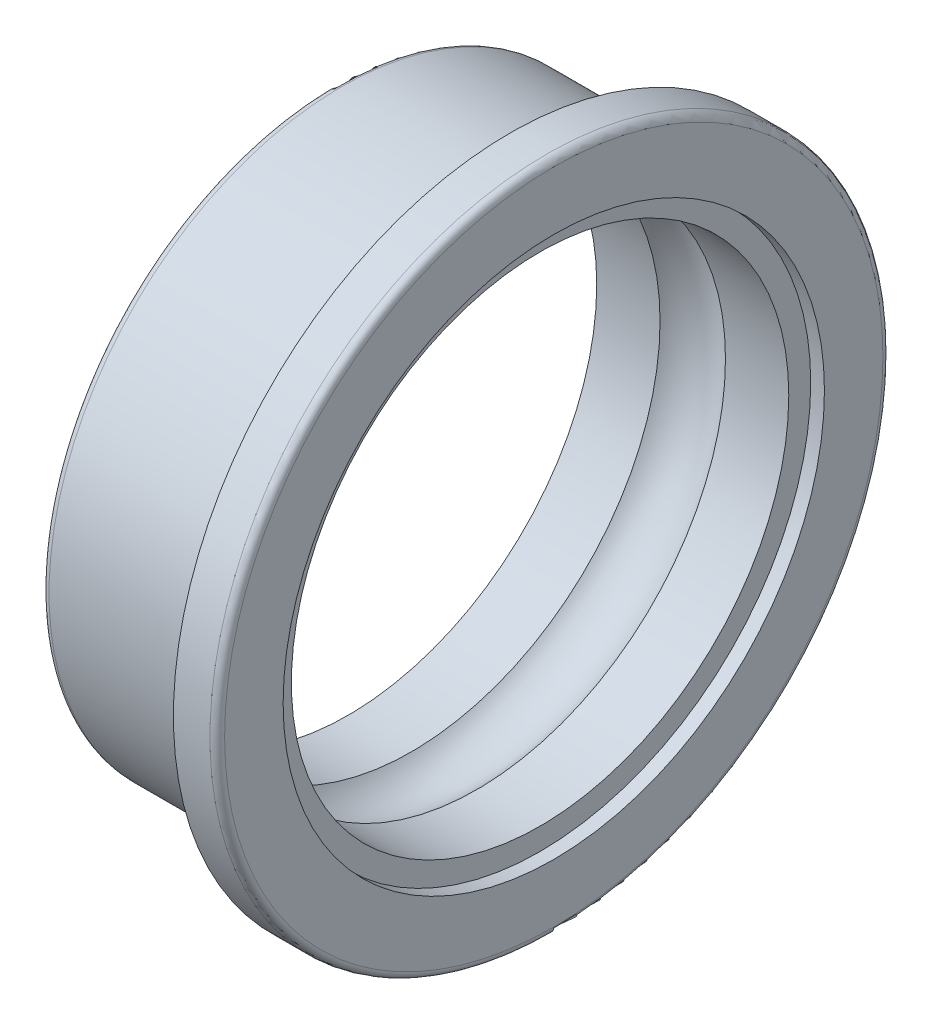
ISO-10303-21;
HEADER;
FILE_DESCRIPTION(('STEP AP214'),'2;1');
FILE_NAME('part.step','',(''),(''),'','','');
FILE_SCHEMA(('AUTOMOTIVE_DESIGN { 1 0 10303 214 1 1 1 1 }'));
ENDSEC;
DATA;
#1=APPLICATION_CONTEXT('core data for automotive mechanical design processes');
#2=APPLICATION_PROTOCOL_DEFINITION('international standard','automotive_design',2000,#1);
#3=PRODUCT_CONTEXT('',#1,'mechanical');
#4=PRODUCT('Part','Part','',(#3));
#5=PRODUCT_RELATED_PRODUCT_CATEGORY('part','',(#4));
#6=PRODUCT_DEFINITION_FORMATION('','',#4);
#7=PRODUCT_DEFINITION_CONTEXT('part definition',#1,'design');
#8=PRODUCT_DEFINITION('design','',#6,#7);
#9=PRODUCT_DEFINITION_SHAPE('','',#8);
#10=(LENGTH_UNIT() NAMED_UNIT(*) SI_UNIT(.MILLI.,.METRE.));
#11=(NAMED_UNIT(*) PLANE_ANGLE_UNIT() SI_UNIT($,.RADIAN.));
#12=(NAMED_UNIT(*) SI_UNIT($,.STERADIAN.) SOLID_ANGLE_UNIT());
#13=UNCERTAINTY_MEASURE_WITH_UNIT(LENGTH_MEASURE(1.E-05),#10,'distance_accuracy_value','');
#14=(GEOMETRIC_REPRESENTATION_CONTEXT(3) GLOBAL_UNCERTAINTY_ASSIGNED_CONTEXT((#13)) GLOBAL_UNIT_ASSIGNED_CONTEXT((#10,
#11,#12)) REPRESENTATION_CONTEXT('',''));
#15=CARTESIAN_POINT('',(0.,0.,0.));
#16=DIRECTION('',(0.,0.,1.));
#17=DIRECTION('',(1.,0.,0.));
#18=AXIS2_PLACEMENT_3D('',#15,#16,#17);
#19=CARTESIAN_POINT('',(0.,3.9,0.));
#20=DIRECTION('',(-1.,0.,0.));
#21=DIRECTION('',(0.,0.,1.));
#22=AXIS2_PLACEMENT_3D('',#19,#20,#21);
#23=PLANE('',#22);
#24=CARTESIAN_POINT('',(0.,0.,0.));
#25=DIRECTION('',(1.,0.,0.));
#26=DIRECTION('',(0.,0.,-1.));
#27=AXIS2_PLACEMENT_3D('',#24,#25,#26);
#28=CIRCLE('',#27,3.7);
#29=CARTESIAN_POINT('',(0.,0.,-3.7));
#30=VERTEX_POINT('',#29);
#31=EDGE_CURVE('E5',#30,#30,#28,.T.);
#32=ORIENTED_EDGE('',*,*,#31,.T.);
#33=EDGE_LOOP('',(#32));
#34=FACE_BOUND('',#33,.T.);
#35=CARTESIAN_POINT('',(0.,0.,0.));
#36=DIRECTION('',(1.,0.,0.));
#37=DIRECTION('',(0.,0.,-1.));
#38=AXIS2_PLACEMENT_3D('',#35,#36,#37);
#39=CIRCLE('',#38,3.89999999635005);
#40=CARTESIAN_POINT('',(0.,0.,-3.89999999635005));
#41=VERTEX_POINT('',#40);
#42=EDGE_CURVE('E9',#41,#41,#39,.T.);
#43=ORIENTED_EDGE('',*,*,#42,.F.);
#44=EDGE_LOOP('',(#43));
#45=FACE_BOUND('',#44,.T.);
#46=ADVANCED_FACE('F13',(#34,#45),#23,.T.);
#47=CARTESIAN_POINT('',(3.,0.,0.));
#48=DIRECTION('',(1.,0.,0.));
#49=DIRECTION('',(0.,0.,-1.));
#50=AXIS2_PLACEMENT_3D('',#47,#48,#49);
#51=CYLINDRICAL_SURFACE('',#50,3.7);
#52=CARTESIAN_POINT('',(0.1875,0.,0.));
#53=DIRECTION('',(1.,0.,0.));
#54=DIRECTION('',(0.,0.,-1.));
#55=AXIS2_PLACEMENT_3D('',#52,#53,#54);
#56=CIRCLE('',#55,3.7);
#57=CARTESIAN_POINT('',(0.1875,0.,-3.7));
#58=VERTEX_POINT('',#57);
#59=EDGE_CURVE('E24',#58,#58,#56,.T.);
#60=ORIENTED_EDGE('',*,*,#59,.T.);
#61=EDGE_LOOP('',(#60));
#62=FACE_BOUND('',#61,.T.);
#63=ORIENTED_EDGE('',*,*,#31,.F.);
#64=EDGE_LOOP('',(#63));
#65=FACE_BOUND('',#64,.T.);
#66=ADVANCED_FACE('F30',(#62,#65),#51,.F.);
#67=CARTESIAN_POINT('',(0.099999999999923,0.,0.));
#68=DIRECTION('',(1.,0.,0.));
#69=DIRECTION('',(0.,0.,-1.));
#70=AXIS2_PLACEMENT_3D('',#67,#68,#69);
#71=TOROIDAL_SURFACE('',#70,3.90000000000007,0.0999999999999235);
#72=ORIENTED_EDGE('',*,*,#42,.T.);
#73=EDGE_LOOP('',(#72));
#74=FACE_BOUND('',#73,.T.);
#75=CARTESIAN_POINT('',(0.1,0.,0.));
#76=DIRECTION('',(1.,0.,0.));
#77=DIRECTION('',(0.,0.,-1.));
#78=AXIS2_PLACEMENT_3D('',#75,#76,#77);
#79=CIRCLE('',#78,4.);
#80=CARTESIAN_POINT('',(0.1,0.,-4.));
#81=VERTEX_POINT('',#80);
#82=EDGE_CURVE('E39',#81,#81,#79,.T.);
#83=ORIENTED_EDGE('',*,*,#82,.F.);
#84=EDGE_LOOP('',(#83));
#85=FACE_BOUND('',#84,.T.);
#86=ADVANCED_FACE('F43',(#74,#85),#71,.T.);
#87=CARTESIAN_POINT('',(0.1875,3.7,0.));
#88=DIRECTION('',(-1.,0.,0.));
#89=DIRECTION('',(0.,0.,1.));
#90=AXIS2_PLACEMENT_3D('',#87,#88,#89);
#91=PLANE('',#90);
#92=CARTESIAN_POINT('',(0.1875,0.,0.));
#93=DIRECTION('',(1.,0.,0.));
#94=DIRECTION('',(0.,0.,-1.));
#95=AXIS2_PLACEMENT_3D('',#92,#93,#94);
#96=CIRCLE('',#95,3.4);
#97=CARTESIAN_POINT('',(0.1875,0.,-3.4));
#98=VERTEX_POINT('',#97);
#99=EDGE_CURVE('E50',#98,#98,#96,.T.);
#100=ORIENTED_EDGE('',*,*,#99,.T.);
#101=EDGE_LOOP('',(#100));
#102=FACE_BOUND('',#101,.T.);
#103=ORIENTED_EDGE('',*,*,#59,.F.);
#104=EDGE_LOOP('',(#103));
#105=FACE_BOUND('',#104,.T.);
#106=ADVANCED_FACE('F56',(#102,#105),#91,.T.);
#107=CARTESIAN_POINT('',(3.,0.,0.));
#108=DIRECTION('',(1.,0.,0.));
#109=DIRECTION('',(0.,0.,-1.));
#110=AXIS2_PLACEMENT_3D('',#107,#108,#109);
#111=CYLINDRICAL_SURFACE('',#110,4.);
#112=ORIENTED_EDGE('',*,*,#82,.T.);
#113=EDGE_LOOP('',(#112));
#114=FACE_BOUND('',#113,.T.);
#115=CARTESIAN_POINT('',(2.4,0.,0.));
#116=DIRECTION('',(1.,0.,0.));
#117=DIRECTION('',(0.,0.,-1.));
#118=AXIS2_PLACEMENT_3D('',#115,#116,#117);
#119=CIRCLE('',#118,4.);
#120=CARTESIAN_POINT('',(2.4,0.,-4.));
#121=VERTEX_POINT('',#120);
#122=EDGE_CURVE('E65',#121,#121,#119,.T.);
#123=ORIENTED_EDGE('',*,*,#122,.F.);
#124=EDGE_LOOP('',(#123));
#125=FACE_BOUND('',#124,.T.);
#126=ADVANCED_FACE('F69',(#114,#125),#111,.T.);
#127=CARTESIAN_POINT('',(3.,0.,0.));
#128=DIRECTION('',(1.,0.,0.));
#129=DIRECTION('',(0.,0.,-1.));
#130=AXIS2_PLACEMENT_3D('',#127,#128,#129);
#131=CYLINDRICAL_SURFACE('',#130,3.4);
#132=CARTESIAN_POINT('',(1.0527864045,0.,0.));
#133=DIRECTION('',(1.,0.,0.));
#134=DIRECTION('',(0.,0.,-1.));
#135=AXIS2_PLACEMENT_3D('',#132,#133,#134);
#136=CIRCLE('',#135,3.4);
#137=CARTESIAN_POINT('',(1.0527864045,0.,-3.4));
#138=VERTEX_POINT('',#137);
#139=EDGE_CURVE('E76',#138,#138,#136,.T.);
#140=ORIENTED_EDGE('',*,*,#139,.T.);
#141=EDGE_LOOP('',(#140));
#142=FACE_BOUND('',#141,.T.);
#143=ORIENTED_EDGE('',*,*,#99,.F.);
#144=EDGE_LOOP('',(#143));
#145=FACE_BOUND('',#144,.T.);
#146=ADVANCED_FACE('F82',(#142,#145),#131,.F.);
#147=CARTESIAN_POINT('',(2.4,4.6,0.));
#148=DIRECTION('',(-1.,0.,0.));
#149=DIRECTION('',(0.,0.,1.));
#150=AXIS2_PLACEMENT_3D('',#147,#148,#149);
#151=PLANE('',#150);
#152=ORIENTED_EDGE('',*,*,#122,.T.);
#153=EDGE_LOOP('',(#152));
#154=FACE_BOUND('',#153,.T.);
#155=CARTESIAN_POINT('',(2.4,0.,0.));
#156=DIRECTION('',(1.,0.,0.));
#157=DIRECTION('',(0.,0.,-1.));
#158=AXIS2_PLACEMENT_3D('',#155,#156,#157);
#159=CIRCLE('',#158,4.6);
#160=CARTESIAN_POINT('',(2.4,0.,-4.6));
#161=VERTEX_POINT('',#160);
#162=EDGE_CURVE('E91',#161,#161,#159,.T.);
#163=ORIENTED_EDGE('',*,*,#162,.F.);
#164=EDGE_LOOP('',(#163));
#165=FACE_BOUND('',#164,.T.);
#166=ADVANCED_FACE('F95',(#154,#165),#151,.T.);
#167=CARTESIAN_POINT('',(1.5,0.,0.));
#168=DIRECTION('',(1.,0.,0.));
#169=DIRECTION('',(0.,0.,-1.));
#170=AXIS2_PLACEMENT_3D('',#167,#168,#169);
#171=TOROIDAL_SURFACE('',#170,2.99999999999991,0.600000000000093);
#172=ORIENTED_EDGE('',*,*,#139,.F.);
#173=EDGE_LOOP('',(#172));
#174=FACE_BOUND('',#173,.T.);
#175=CARTESIAN_POINT('',(1.9472135955,0.,0.));
#176=DIRECTION('',(1.,0.,0.));
#177=DIRECTION('',(0.,0.,-1.));
#178=AXIS2_PLACEMENT_3D('',#175,#176,#177);
#179=CIRCLE('',#178,3.4);
#180=CARTESIAN_POINT('',(1.9472135955,0.,-3.4));
#181=VERTEX_POINT('',#180);
#182=EDGE_CURVE('E104',#181,#181,#179,.T.);
#183=ORIENTED_EDGE('',*,*,#182,.T.);
#184=EDGE_LOOP('',(#183));
#185=FACE_BOUND('',#184,.T.);
#186=ADVANCED_FACE('F108',(#174,#185),#171,.F.);
#187=CARTESIAN_POINT('',(3.,0.,0.));
#188=DIRECTION('',(1.,0.,0.));
#189=DIRECTION('',(0.,0.,-1.));
#190=AXIS2_PLACEMENT_3D('',#187,#188,#189);
#191=CYLINDRICAL_SURFACE('',#190,4.6);
#192=ORIENTED_EDGE('',*,*,#162,.T.);
#193=EDGE_LOOP('',(#192));
#194=FACE_BOUND('',#193,.T.);
#195=CARTESIAN_POINT('',(2.9,0.,0.));
#196=DIRECTION('',(1.,0.,0.));
#197=DIRECTION('',(0.,0.,-1.));
#198=AXIS2_PLACEMENT_3D('',#195,#196,#197);
#199=CIRCLE('',#198,4.6);
#200=CARTESIAN_POINT('',(2.9,0.,-4.6));
#201=VERTEX_POINT('',#200);
#202=EDGE_CURVE('E117',#201,#201,#199,.T.);
#203=ORIENTED_EDGE('',*,*,#202,.F.);
#204=EDGE_LOOP('',(#203));
#205=FACE_BOUND('',#204,.T.);
#206=ADVANCED_FACE('F121',(#194,#205),#191,.T.);
#207=CARTESIAN_POINT('',(3.,0.,0.));
#208=DIRECTION('',(1.,0.,0.));
#209=DIRECTION('',(0.,0.,-1.));
#210=AXIS2_PLACEMENT_3D('',#207,#208,#209);
#211=CYLINDRICAL_SURFACE('',#210,3.4);
#212=CARTESIAN_POINT('',(2.8125,0.,0.));
#213=DIRECTION('',(1.,0.,0.));
#214=DIRECTION('',(0.,0.,-1.));
#215=AXIS2_PLACEMENT_3D('',#212,#213,#214);
#216=CIRCLE('',#215,3.4);
#217=CARTESIAN_POINT('',(2.8125,0.,-3.4));
#218=VERTEX_POINT('',#217);
#219=EDGE_CURVE('E128',#218,#218,#216,.T.);
#220=ORIENTED_EDGE('',*,*,#219,.T.);
#221=EDGE_LOOP('',(#220));
#222=FACE_BOUND('',#221,.T.);
#223=ORIENTED_EDGE('',*,*,#182,.F.);
#224=EDGE_LOOP('',(#223));
#225=FACE_BOUND('',#224,.T.);
#226=ADVANCED_FACE('F134',(#222,#225),#211,.F.);
#227=CARTESIAN_POINT('',(2.90000000000015,0.,0.));
#228=DIRECTION('',(1.,0.,0.));
#229=DIRECTION('',(0.,0.,-1.));
#230=AXIS2_PLACEMENT_3D('',#227,#228,#229);
#231=TOROIDAL_SURFACE('',#230,4.50000000000015,0.0999999999998467);
#232=ORIENTED_EDGE('',*,*,#202,.T.);
#233=EDGE_LOOP('',(#232));
#234=FACE_BOUND('',#233,.T.);
#235=CARTESIAN_POINT('',(3.,0.,0.));
#236=DIRECTION('',(1.,0.,0.));
#237=DIRECTION('',(0.,0.,-1.));
#238=AXIS2_PLACEMENT_3D('',#235,#236,#237);
#239=CIRCLE('',#238,4.49999998211876);
#240=CARTESIAN_POINT('',(3.,0.,-4.49999998211876));
#241=VERTEX_POINT('',#240);
#242=EDGE_CURVE('E143',#241,#241,#239,.T.);
#243=ORIENTED_EDGE('',*,*,#242,.F.);
#244=EDGE_LOOP('',(#243));
#245=FACE_BOUND('',#244,.T.);
#246=ADVANCED_FACE('F147',(#234,#245),#231,.T.);
#247=CARTESIAN_POINT('',(2.8125,3.4,0.));
#248=DIRECTION('',(1.,0.,0.));
#249=DIRECTION('',(0.,0.,-1.));
#250=AXIS2_PLACEMENT_3D('',#247,#248,#249);
#251=PLANE('',#250);
#252=CARTESIAN_POINT('',(2.8125,0.,0.));
#253=DIRECTION('',(1.,0.,0.));
#254=DIRECTION('',(0.,0.,-1.));
#255=AXIS2_PLACEMENT_3D('',#252,#253,#254);
#256=CIRCLE('',#255,3.7);
#257=CARTESIAN_POINT('',(2.8125,0.,-3.7));
#258=VERTEX_POINT('',#257);
#259=EDGE_CURVE('E154',#258,#258,#256,.T.);
#260=ORIENTED_EDGE('',*,*,#259,.T.);
#261=EDGE_LOOP('',(#260));
#262=FACE_BOUND('',#261,.T.);
#263=ORIENTED_EDGE('',*,*,#219,.F.);
#264=EDGE_LOOP('',(#263));
#265=FACE_BOUND('',#264,.T.);
#266=ADVANCED_FACE('F160',(#262,#265),#251,.T.);
#267=CARTESIAN_POINT('',(3.,3.7,0.));
#268=DIRECTION('',(1.,0.,0.));
#269=DIRECTION('',(0.,0.,-1.));
#270=AXIS2_PLACEMENT_3D('',#267,#268,#269);
#271=PLANE('',#270);
#272=ORIENTED_EDGE('',*,*,#242,.T.);
#273=EDGE_LOOP('',(#272));
#274=FACE_BOUND('',#273,.T.);
#275=CARTESIAN_POINT('',(3.,0.,0.));
#276=DIRECTION('',(1.,0.,0.));
#277=DIRECTION('',(0.,0.,-1.));
#278=AXIS2_PLACEMENT_3D('',#275,#276,#277);
#279=CIRCLE('',#278,3.7);
#280=CARTESIAN_POINT('',(3.,0.,-3.7));
#281=VERTEX_POINT('',#280);
#282=EDGE_CURVE('E169',#281,#281,#279,.T.);
#283=ORIENTED_EDGE('',*,*,#282,.F.);
#284=EDGE_LOOP('',(#283));
#285=FACE_BOUND('',#284,.T.);
#286=ADVANCED_FACE('F173',(#274,#285),#271,.T.);
#287=CARTESIAN_POINT('',(3.,0.,0.));
#288=DIRECTION('',(1.,0.,0.));
#289=DIRECTION('',(0.,0.,-1.));
#290=AXIS2_PLACEMENT_3D('',#287,#288,#289);
#291=CYLINDRICAL_SURFACE('',#290,3.7);
#292=ORIENTED_EDGE('',*,*,#282,.T.);
#293=EDGE_LOOP('',(#292));
#294=FACE_BOUND('',#293,.T.);
#295=ORIENTED_EDGE('',*,*,#259,.F.);
#296=EDGE_LOOP('',(#295));
#297=FACE_BOUND('',#296,.T.);
#298=ADVANCED_FACE('F184',(#294,#297),#291,.F.);
#299=CLOSED_SHELL('',(#46,#66,#86,#106,#126,#146,#166,#186,#206,#226,#246,#266,#286,#298));
#300=MANIFOLD_SOLID_BREP('B1',#299);
#301=ADVANCED_BREP_SHAPE_REPRESENTATION('',(#18,#300),#14);
#302=SHAPE_DEFINITION_REPRESENTATION(#9,#301);
ENDSEC;
END-ISO-10303-21;
